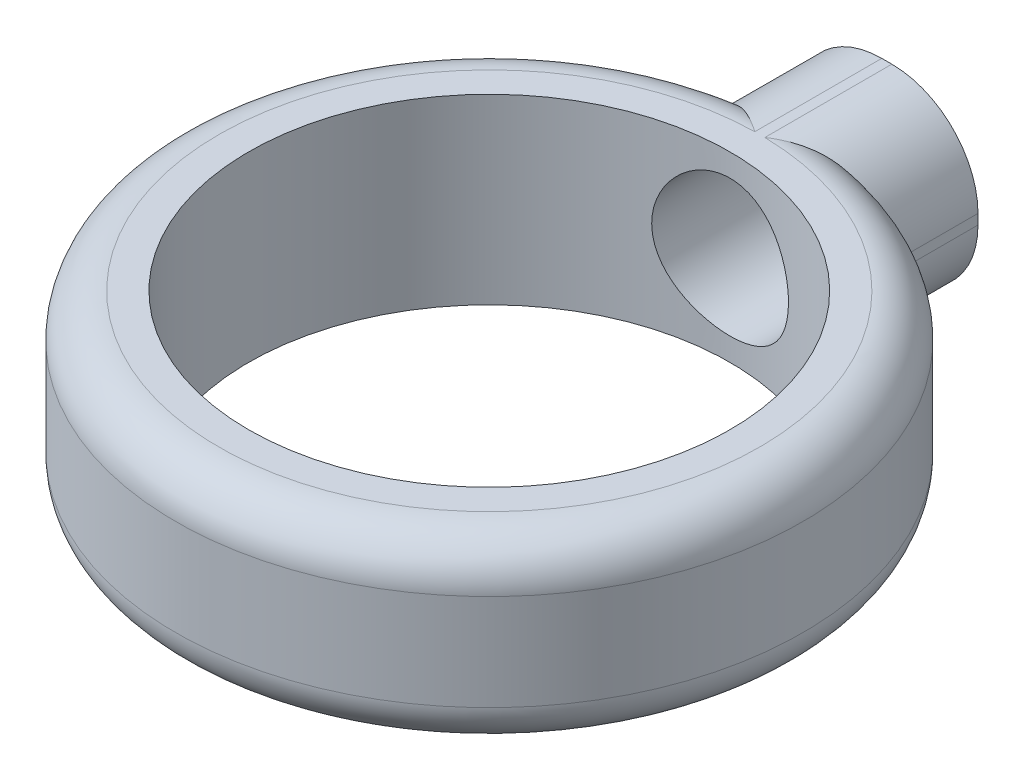
ISO-10303-21;
HEADER;
FILE_DESCRIPTION(('STEP AP214'),'2;1');
FILE_NAME('part.step','',(''),(''),'','','');
FILE_SCHEMA(('AUTOMOTIVE_DESIGN { 1 0 10303 214 1 1 1 1 }'));
ENDSEC;
DATA;
#1=APPLICATION_CONTEXT('core data for automotive mechanical design processes');
#2=APPLICATION_PROTOCOL_DEFINITION('international standard','automotive_design',2000,#1);
#3=PRODUCT_CONTEXT('',#1,'mechanical');
#4=PRODUCT('Part','Part','',(#3));
#5=PRODUCT_RELATED_PRODUCT_CATEGORY('part','',(#4));
#6=PRODUCT_DEFINITION_FORMATION('','',#4);
#7=PRODUCT_DEFINITION_CONTEXT('part definition',#1,'design');
#8=PRODUCT_DEFINITION('design','',#6,#7);
#9=PRODUCT_DEFINITION_SHAPE('','',#8);
#10=(LENGTH_UNIT() NAMED_UNIT(*) SI_UNIT(.MILLI.,.METRE.));
#11=(NAMED_UNIT(*) PLANE_ANGLE_UNIT() SI_UNIT($,.RADIAN.));
#12=(NAMED_UNIT(*) SI_UNIT($,.STERADIAN.) SOLID_ANGLE_UNIT());
#13=UNCERTAINTY_MEASURE_WITH_UNIT(LENGTH_MEASURE(1.E-05),#10,'distance_accuracy_value','');
#14=(GEOMETRIC_REPRESENTATION_CONTEXT(3) GLOBAL_UNCERTAINTY_ASSIGNED_CONTEXT((#13)) GLOBAL_UNIT_ASSIGNED_CONTEXT((#10,
#11,#12)) REPRESENTATION_CONTEXT('',''));
#15=CARTESIAN_POINT('',(0.,0.,0.));
#16=DIRECTION('',(0.,0.,1.));
#17=DIRECTION('',(1.,0.,0.));
#18=AXIS2_PLACEMENT_3D('',#15,#16,#17);
#19=CARTESIAN_POINT('',(0.,12.7,0.));
#20=DIRECTION('',(0.,1.,0.));
#21=DIRECTION('',(0.,0.,1.));
#22=AXIS2_PLACEMENT_3D('',#19,#20,#21);
#23=PLANE('',#22);
#24=DIRECTION('',(-1.,0.,0.));
#25=VECTOR('',#24,1.);
#26=CARTESIAN_POINT('',(6.35,12.7,-27.686));
#27=LINE('',#26,#25);
#28=CARTESIAN_POINT('',(0.35,12.7,-27.686));
#29=VERTEX_POINT('',#28);
#30=CARTESIAN_POINT('',(-0.35,12.7,-27.686));
#31=VERTEX_POINT('',#30);
#32=EDGE_CURVE('E257',#29,#31,#27,.T.);
#33=ORIENTED_EDGE('',*,*,#32,.T.);
#34=DIRECTION('',(0.,0.,1.));
#35=VECTOR('',#34,1.);
#36=CARTESIAN_POINT('',(-0.349999999999997,12.7,-17.7418667563478));
#37=LINE('',#36,#35);
#38=CARTESIAN_POINT('',(-0.349999999999997,12.7,-18.8407493481549));
#39=VERTEX_POINT('',#38);
#40=EDGE_CURVE('E160',#31,#39,#37,.T.);
#41=ORIENTED_EDGE('',*,*,#40,.T.);
#42=CARTESIAN_POINT('',(0.,12.7,0.));
#43=DIRECTION('',(0.,1.,0.));
#44=DIRECTION('',(0.,0.,1.));
#45=AXIS2_PLACEMENT_3D('',#42,#43,#44);
#46=CIRCLE('',#45,18.844);
#47=CARTESIAN_POINT('',(0.349999999999997,12.7,-18.8407493481549));
#48=VERTEX_POINT('',#47);
#49=EDGE_CURVE('E138',#39,#48,#46,.T.);
#50=ORIENTED_EDGE('',*,*,#49,.T.);
#51=DIRECTION('',(0.,0.,-1.));
#52=VECTOR('',#51,1.);
#53=CARTESIAN_POINT('',(0.35,12.7,-27.686));
#54=LINE('',#53,#52);
#55=EDGE_CURVE('E157',#48,#29,#54,.T.);
#56=ORIENTED_EDGE('',*,*,#55,.T.);
#57=EDGE_LOOP('',(#33,#41,#50,#56));
#58=FACE_BOUND('',#57,.T.);
#59=CARTESIAN_POINT('',(0.,12.7,0.));
#60=DIRECTION('',(0.,1.,0.));
#61=DIRECTION('',(0.,0.,1.));
#62=AXIS2_PLACEMENT_3D('',#59,#60,#61);
#63=CIRCLE('',#62,16.764);
#64=CARTESIAN_POINT('',(0.,12.7,16.764));
#65=VERTEX_POINT('',#64);
#66=EDGE_CURVE('E279',#65,#65,#63,.T.);
#67=ORIENTED_EDGE('',*,*,#66,.F.);
#68=EDGE_LOOP('',(#67));
#69=FACE_BOUND('',#68,.T.);
#70=ADVANCED_FACE('F32',(#58,#69),#23,.T.);
#71=CARTESIAN_POINT('',(0.,0.,0.));
#72=DIRECTION('',(0.,1.,0.));
#73=DIRECTION('',(0.,0.,1.));
#74=AXIS2_PLACEMENT_3D('',#71,#72,#73);
#75=PLANE('',#74);
#76=CARTESIAN_POINT('',(0.,0.,0.));
#77=DIRECTION('',(0.,1.,0.));
#78=DIRECTION('',(0.,0.,1.));
#79=AXIS2_PLACEMENT_3D('',#76,#77,#78);
#80=CIRCLE('',#79,18.844);
#81=CARTESIAN_POINT('',(0.349999999999997,0.,-18.8407493481549));
#82=VERTEX_POINT('',#81);
#83=CARTESIAN_POINT('',(-0.349999999999997,0.,-18.8407493481549));
#84=VERTEX_POINT('',#83);
#85=EDGE_CURVE('E142',#82,#84,#80,.F.);
#86=ORIENTED_EDGE('',*,*,#85,.T.);
#87=DIRECTION('',(0.,0.,1.));
#88=VECTOR('',#87,1.);
#89=CARTESIAN_POINT('',(-0.349999999999993,0.,0.));
#90=LINE('',#89,#88);
#91=CARTESIAN_POINT('',(-0.35,0.,-27.686));
#92=VERTEX_POINT('',#91);
#93=EDGE_CURVE('E148',#84,#92,#90,.F.);
#94=ORIENTED_EDGE('',*,*,#93,.T.);
#95=DIRECTION('',(-1.,0.,0.));
#96=VECTOR('',#95,1.);
#97=CARTESIAN_POINT('',(6.35,0.,-27.686));
#98=LINE('',#97,#96);
#99=CARTESIAN_POINT('',(0.35,0.,-27.686));
#100=VERTEX_POINT('',#99);
#101=EDGE_CURVE('E278',#100,#92,#98,.T.);
#102=ORIENTED_EDGE('',*,*,#101,.F.);
#103=DIRECTION('',(0.,0.,-1.));
#104=VECTOR('',#103,1.);
#105=CARTESIAN_POINT('',(0.349999999999993,0.,0.));
#106=LINE('',#105,#104);
#107=EDGE_CURVE('E140',#100,#82,#106,.F.);
#108=ORIENTED_EDGE('',*,*,#107,.T.);
#109=EDGE_LOOP('',(#86,#94,#102,#108));
#110=FACE_BOUND('',#109,.T.);
#111=CARTESIAN_POINT('',(0.,0.,0.));
#112=DIRECTION('',(0.,1.,0.));
#113=DIRECTION('',(0.,0.,1.));
#114=AXIS2_PLACEMENT_3D('',#111,#112,#113);
#115=CIRCLE('',#114,16.764);
#116=CARTESIAN_POINT('',(0.,0.,16.764));
#117=VERTEX_POINT('',#116);
#118=EDGE_CURVE('E282',#117,#117,#115,.T.);
#119=ORIENTED_EDGE('',*,*,#118,.T.);
#120=EDGE_LOOP('',(#119));
#121=FACE_BOUND('',#120,.T.);
#122=ADVANCED_FACE('F224',(#110,#121),#75,.F.);
#123=CARTESIAN_POINT('',(6.35,12.7,-27.686));
#124=DIRECTION('',(0.,0.,1.));
#125=DIRECTION('',(1.,0.,0.));
#126=AXIS2_PLACEMENT_3D('',#123,#124,#125);
#127=PLANE('',#126);
#128=CARTESIAN_POINT('',(0.,6.35,-27.686));
#129=DIRECTION('',(0.,0.,-1.));
#130=DIRECTION('',(-1.,0.,0.));
#131=AXIS2_PLACEMENT_3D('',#128,#129,#130);
#132=CIRCLE('',#131,4.7625);
#133=CARTESIAN_POINT('',(-4.7625,6.35,-27.686));
#134=VERTEX_POINT('',#133);
#135=EDGE_CURVE('E286',#134,#134,#132,.T.);
#136=ORIENTED_EDGE('',*,*,#135,.F.);
#137=EDGE_LOOP('',(#136));
#138=FACE_BOUND('',#137,.T.);
#139=ORIENTED_EDGE('',*,*,#101,.T.);
#140=CARTESIAN_POINT('',(-0.35,6.,-27.686));
#141=DIRECTION('',(0.,0.,1.));
#142=DIRECTION('',(1.,0.,0.));
#143=AXIS2_PLACEMENT_3D('',#140,#141,#142);
#144=CIRCLE('',#143,6.);
#145=CARTESIAN_POINT('',(-6.35,6.,-27.686));
#146=VERTEX_POINT('',#145);
#147=EDGE_CURVE('E155',#92,#146,#144,.F.);
#148=ORIENTED_EDGE('',*,*,#147,.T.);
#149=DIRECTION('',(0.,-1.,0.));
#150=VECTOR('',#149,1.);
#151=CARTESIAN_POINT('',(-6.35,12.7,-27.686));
#152=LINE('',#151,#150);
#153=CARTESIAN_POINT('',(-6.35,6.7,-27.686));
#154=VERTEX_POINT('',#153);
#155=EDGE_CURVE('E131',#154,#146,#152,.T.);
#156=ORIENTED_EDGE('',*,*,#155,.F.);
#157=CARTESIAN_POINT('',(-0.35,6.7,-27.686));
#158=DIRECTION('',(0.,0.,1.));
#159=DIRECTION('',(1.,0.,0.));
#160=AXIS2_PLACEMENT_3D('',#157,#158,#159);
#161=CIRCLE('',#160,6.);
#162=EDGE_CURVE('E137',#154,#31,#161,.F.);
#163=ORIENTED_EDGE('',*,*,#162,.T.);
#164=ORIENTED_EDGE('',*,*,#32,.F.);
#165=CARTESIAN_POINT('',(0.35,6.7,-27.686));
#166=DIRECTION('',(0.,0.,1.));
#167=DIRECTION('',(1.,0.,0.));
#168=AXIS2_PLACEMENT_3D('',#165,#166,#167);
#169=CIRCLE('',#168,6.);
#170=CARTESIAN_POINT('',(6.35,6.7,-27.686));
#171=VERTEX_POINT('',#170);
#172=EDGE_CURVE('E152',#29,#171,#169,.F.);
#173=ORIENTED_EDGE('',*,*,#172,.T.);
#174=DIRECTION('',(0.,-1.,0.));
#175=VECTOR('',#174,1.);
#176=CARTESIAN_POINT('',(6.35,12.7,-27.686));
#177=LINE('',#176,#175);
#178=CARTESIAN_POINT('',(6.35,6.,-27.686));
#179=VERTEX_POINT('',#178);
#180=EDGE_CURVE('E251',#171,#179,#177,.T.);
#181=ORIENTED_EDGE('',*,*,#180,.T.);
#182=CARTESIAN_POINT('',(0.35,6.,-27.686));
#183=DIRECTION('',(0.,0.,1.));
#184=DIRECTION('',(1.,0.,0.));
#185=AXIS2_PLACEMENT_3D('',#182,#183,#184);
#186=CIRCLE('',#185,6.);
#187=EDGE_CURVE('E150',#179,#100,#186,.F.);
#188=ORIENTED_EDGE('',*,*,#187,.T.);
#189=EDGE_LOOP('',(#139,#148,#156,#163,#164,#173,#181,#188));
#190=FACE_BOUND('',#189,.T.);
#191=ADVANCED_FACE('F221',(#138,#190),#127,.F.);
#192=CARTESIAN_POINT('',(-6.35,12.7,-27.686));
#193=DIRECTION('',(1.,0.,0.));
#194=DIRECTION('',(0.,0.,-1.));
#195=AXIS2_PLACEMENT_3D('',#192,#193,#194);
#196=PLANE('',#195);
#197=ORIENTED_EDGE('',*,*,#155,.T.);
#198=DIRECTION('',(0.,0.,1.));
#199=VECTOR('',#198,1.);
#200=CARTESIAN_POINT('',(-6.35,6.,-27.686));
#201=LINE('',#200,#199);
#202=CARTESIAN_POINT('',(-6.35,6.,-20.9006659224054));
#203=VERTEX_POINT('',#202);
#204=EDGE_CURVE('E130',#146,#203,#201,.T.);
#205=ORIENTED_EDGE('',*,*,#204,.T.);
#206=DIRECTION('',(0.,-1.,0.));
#207=VECTOR('',#206,1.);
#208=CARTESIAN_POINT('',(-6.35,12.7,-20.9006659224054));
#209=LINE('',#208,#207);
#210=CARTESIAN_POINT('',(-6.35,6.7,-20.9006659224054));
#211=VERTEX_POINT('',#210);
#212=EDGE_CURVE('E116',#211,#203,#209,.T.);
#213=ORIENTED_EDGE('',*,*,#212,.F.);
#214=DIRECTION('',(0.,0.,1.));
#215=VECTOR('',#214,1.);
#216=CARTESIAN_POINT('',(-6.35,6.7,-27.686));
#217=LINE('',#216,#215);
#218=EDGE_CURVE('E127',#211,#154,#217,.F.);
#219=ORIENTED_EDGE('',*,*,#218,.T.);
#220=EDGE_LOOP('',(#197,#205,#213,#219));
#221=FACE_BOUND('',#220,.T.);
#222=ADVANCED_FACE('F126',(#221),#196,.F.);
#223=CARTESIAN_POINT('',(0.,12.7,0.));
#224=DIRECTION('',(0.,-1.,0.));
#225=DIRECTION('',(0.,0.,-1.));
#226=AXIS2_PLACEMENT_3D('',#223,#224,#225);
#227=CYLINDRICAL_SURFACE('',#226,21.844);
#228=CARTESIAN_POINT('',(0.,9.7,0.));
#229=DIRECTION('',(0.,1.,0.));
#230=DIRECTION('',(0.,0.,1.));
#231=AXIS2_PLACEMENT_3D('',#228,#229,#230);
#232=CIRCLE('',#231,21.844);
#233=CARTESIAN_POINT('',(5.54615242270663,9.7,-21.1281927600092));
#234=VERTEX_POINT('',#233);
#235=CARTESIAN_POINT('',(-5.54615242270663,9.7,-21.1281927600092));
#236=VERTEX_POINT('',#235);
#237=EDGE_CURVE('E59',#234,#236,#232,.F.);
#238=ORIENTED_EDGE('',*,*,#237,.T.);
#239=CARTESIAN_POINT('',(-5.54615242270663,9.7,-21.1281927600092));
#240=CARTESIAN_POINT('',(-5.62869555834243,9.55706241046992,-21.1065181383437));
#241=CARTESIAN_POINT('',(-5.70538652745696,9.41057678959266,-21.0858761637742));
#242=CARTESIAN_POINT('',(-5.8465725633866,9.11143295779543,-21.0471700747369));
#243=CARTESIAN_POINT('',(-5.9110620329338,8.95877195279276,-21.0291071442974));
#244=CARTESIAN_POINT('',(-6.02598011956818,8.65179772322703,-20.9964609210033));
#245=CARTESIAN_POINT('',(-6.0766904303833,8.49759741637347,-20.9818089653315));
#246=CARTESIAN_POINT('',(-6.16548658934499,8.18541181959385,-20.9558882274492));
#247=CARTESIAN_POINT('',(-6.20357792667038,8.02742820753624,-20.9446179744198));
#248=CARTESIAN_POINT('',(-6.27304882696002,7.67736376686289,-20.9239284567496));
#249=CARTESIAN_POINT('',(-6.30164871291669,7.48467007857076,-20.9153051907715));
#250=CARTESIAN_POINT('',(-6.33053798954638,7.19286308526323,-20.9065710322217));
#251=CARTESIAN_POINT('',(-6.3378332828715,7.09445054443067,-20.9043594155445));
#252=CARTESIAN_POINT('',(-6.3475642560985,6.89736516420813,-20.9014061351694));
#253=CARTESIAN_POINT('',(-6.3500000159953,6.79869232912974,-20.9006644472744));
#254=CARTESIAN_POINT('',(-6.35,6.7,-20.9006659224054));
#255=B_SPLINE_CURVE_WITH_KNOTS('',3,(#239,#240,#241,#242,#243,#244,#245,#246,#247,#248,#249,
#250,#251,#252,#253,#254),.UNSPECIFIED.,.F.,.F.,(4,2,2,2,2,2,2,4),(0.,0.499301875187812,
0.998832245734701,1.4872138569556,1.97538274525619,2.55925196054153,2.85526223868959,
3.1512676440418),.UNSPECIFIED.);
#256=EDGE_CURVE('E113',#236,#211,#255,.T.);
#257=ORIENTED_EDGE('',*,*,#256,.T.);
#258=ORIENTED_EDGE('',*,*,#212,.T.);
#259=CARTESIAN_POINT('',(-6.35,6.,-20.9006659224054));
#260=CARTESIAN_POINT('',(-6.35002280042576,5.83353583030063,-20.9006432846822));
#261=CARTESIAN_POINT('',(-6.34307336288711,5.66707922686271,-20.9027699308018));
#262=CARTESIAN_POINT('',(-6.31539495313004,5.33540609973612,-20.9111574628453));
#263=CARTESIAN_POINT('',(-6.29466491293805,5.17018967316273,-20.9174186691904));
#264=CARTESIAN_POINT('',(-6.24019688695677,4.84586003229475,-20.9337292979374));
#265=CARTESIAN_POINT('',(-6.20675550315686,4.6866925452103,-20.9436922341856));
#266=CARTESIAN_POINT('',(-6.12716432241518,4.37189461541182,-20.9671150326871));
#267=CARTESIAN_POINT('',(-6.08101862636097,4.21626304883969,-20.9805737664356));
#268=CARTESIAN_POINT('',(-5.96607242242846,3.87931241884731,-21.013581426997));
#269=CARTESIAN_POINT('',(-5.89460062008399,3.69896619012894,-21.0338076546501));
#270=CARTESIAN_POINT('',(-5.73370250523079,3.34399833846208,-21.0782322748146));
#271=CARTESIAN_POINT('',(-5.64404692942392,3.16948680177053,-21.1024805846146));
#272=CARTESIAN_POINT('',(-5.54615242270663,3.,-21.1281927600092));
#273=B_SPLINE_CURVE_WITH_KNOTS('',3,(#259,#260,#261,#262,#263,#264,#265,#266,#267,#268,#269,
#270,#271,#272),.UNSPECIFIED.,.F.,.F.,(4,2,2,2,2,2,4),(0.,0.499222724076475,0.998484141586656,
1.48674768267672,1.97485379919353,2.55902587045443,3.15108073405853),.UNSPECIFIED.);
#274=CARTESIAN_POINT('',(-5.54615242270663,3.,-21.1281927600092));
#275=VERTEX_POINT('',#274);
#276=EDGE_CURVE('E168',#203,#275,#273,.T.);
#277=ORIENTED_EDGE('',*,*,#276,.T.);
#278=CARTESIAN_POINT('',(0.,3.,0.));
#279=DIRECTION('',(0.,1.,0.));
#280=DIRECTION('',(0.,0.,1.));
#281=AXIS2_PLACEMENT_3D('',#278,#279,#280);
#282=CIRCLE('',#281,21.844);
#283=CARTESIAN_POINT('',(5.54615242270663,3.,-21.1281927600092));
#284=VERTEX_POINT('',#283);
#285=EDGE_CURVE('E51',#275,#284,#282,.T.);
#286=ORIENTED_EDGE('',*,*,#285,.T.);
#287=CARTESIAN_POINT('',(5.54615242270663,3.,-21.1281927600092));
#288=CARTESIAN_POINT('',(5.62869555834243,3.14293758953008,-21.1065181383437));
#289=CARTESIAN_POINT('',(5.70538652745696,3.28942321040734,-21.0858761637742));
#290=CARTESIAN_POINT('',(5.8465725633866,3.58856704220457,-21.0471700747369));
#291=CARTESIAN_POINT('',(5.9110620329338,3.74122804720724,-21.0291071442973));
#292=CARTESIAN_POINT('',(6.02598011956818,4.04820227677297,-20.9964609210033));
#293=CARTESIAN_POINT('',(6.0766904303833,4.20240258362653,-20.9818089653315));
#294=CARTESIAN_POINT('',(6.16548658934499,4.51458818040614,-20.9558882274492));
#295=CARTESIAN_POINT('',(6.20357792667038,4.67257179246375,-20.9446179744198));
#296=CARTESIAN_POINT('',(6.27304882696002,5.02263623313711,-20.9239284567496));
#297=CARTESIAN_POINT('',(6.30164871291669,5.21532992142924,-20.9153051907715));
#298=CARTESIAN_POINT('',(6.33053798954638,5.50713691473677,-20.9065710322217));
#299=CARTESIAN_POINT('',(6.3378332828715,5.60554945556933,-20.9043594155445));
#300=CARTESIAN_POINT('',(6.3475642560985,5.80263483579187,-20.9014061351694));
#301=CARTESIAN_POINT('',(6.3500000159953,5.90130767087026,-20.9006644472744));
#302=CARTESIAN_POINT('',(6.35,6.,-20.9006659224054));
#303=B_SPLINE_CURVE_WITH_KNOTS('',3,(#287,#288,#289,#290,#291,#292,#293,#294,#295,#296,#297,
#298,#299,#300,#301,#302),.UNSPECIFIED.,.F.,.F.,(4,2,2,2,2,2,2,4),(0.,0.499301875187811,
0.9988322457347,1.48721385695559,1.97538274525619,2.55925196054153,2.85526223868959,
3.1512676440418),.UNSPECIFIED.);
#304=CARTESIAN_POINT('',(6.34999999999999,6.,-20.9006659224054));
#305=VERTEX_POINT('',#304);
#306=EDGE_CURVE('E11',#284,#305,#303,.T.);
#307=ORIENTED_EDGE('',*,*,#306,.T.);
#308=DIRECTION('',(0.,-1.,0.));
#309=VECTOR('',#308,1.);
#310=CARTESIAN_POINT('',(6.34999999999999,12.7,-20.9006659224054));
#311=LINE('',#310,#309);
#312=CARTESIAN_POINT('',(6.34999999999999,6.7,-20.9006659224054));
#313=VERTEX_POINT('',#312);
#314=EDGE_CURVE('E132',#313,#305,#311,.T.);
#315=ORIENTED_EDGE('',*,*,#314,.F.);
#316=CARTESIAN_POINT('',(6.35,6.7,-20.9006659224054));
#317=CARTESIAN_POINT('',(6.35002280042576,6.86646416969937,-20.9006432846822));
#318=CARTESIAN_POINT('',(6.34307336288711,7.03292077313729,-20.9027699308018));
#319=CARTESIAN_POINT('',(6.31539495313004,7.36459390026388,-20.9111574628453));
#320=CARTESIAN_POINT('',(6.29466491293805,7.52981032683727,-20.9174186691904));
#321=CARTESIAN_POINT('',(6.24019688695677,7.85413996770525,-20.9337292979374));
#322=CARTESIAN_POINT('',(6.20675550315686,8.0133074547897,-20.9436922341856));
#323=CARTESIAN_POINT('',(6.12716432241518,8.32810538458818,-20.9671150326871));
#324=CARTESIAN_POINT('',(6.08101862636097,8.4837369511603,-20.9805737664356));
#325=CARTESIAN_POINT('',(5.96607242242846,8.82068758115269,-21.013581426997));
#326=CARTESIAN_POINT('',(5.89460062008399,9.00103380987106,-21.0338076546501));
#327=CARTESIAN_POINT('',(5.73370250523079,9.35600166153792,-21.0782322748146));
#328=CARTESIAN_POINT('',(5.64404692942392,9.53051319822947,-21.1024805846146));
#329=CARTESIAN_POINT('',(5.54615242270663,9.7,-21.1281927600092));
#330=B_SPLINE_CURVE_WITH_KNOTS('',3,(#316,#317,#318,#319,#320,#321,#322,#323,#324,#325,#326,
#327,#328,#329),.UNSPECIFIED.,.F.,.F.,(4,2,2,2,2,2,4),(0.,0.499222724076475,0.998484141586655,
1.48674768267672,1.97485379919353,2.55902587045443,3.15108073405853),.UNSPECIFIED.);
#331=EDGE_CURVE('E120',#313,#234,#330,.T.);
#332=ORIENTED_EDGE('',*,*,#331,.T.);
#333=EDGE_LOOP('',(#238,#257,#258,#277,#286,#307,#315,#332));
#334=FACE_BOUND('',#333,.T.);
#335=ADVANCED_FACE('F115',(#334),#227,.T.);
#336=CARTESIAN_POINT('',(6.35,12.7,-20.9006659224054));
#337=DIRECTION('',(-1.,0.,0.));
#338=DIRECTION('',(0.,0.,1.));
#339=AXIS2_PLACEMENT_3D('',#336,#337,#338);
#340=PLANE('',#339);
#341=ORIENTED_EDGE('',*,*,#180,.F.);
#342=DIRECTION('',(0.,0.,-1.));
#343=VECTOR('',#342,1.);
#344=CARTESIAN_POINT('',(6.35,6.7,-17.7418667563478));
#345=LINE('',#344,#343);
#346=EDGE_CURVE('E166',#171,#313,#345,.F.);
#347=ORIENTED_EDGE('',*,*,#346,.T.);
#348=ORIENTED_EDGE('',*,*,#314,.T.);
#349=DIRECTION('',(0.,0.,-1.));
#350=VECTOR('',#349,1.);
#351=CARTESIAN_POINT('',(6.35,6.,-20.9006659224054));
#352=LINE('',#351,#350);
#353=EDGE_CURVE('E163',#305,#179,#352,.T.);
#354=ORIENTED_EDGE('',*,*,#353,.T.);
#355=EDGE_LOOP('',(#341,#347,#348,#354));
#356=FACE_BOUND('',#355,.T.);
#357=ADVANCED_FACE('F230',(#356),#340,.F.);
#358=CARTESIAN_POINT('',(0.,12.7,0.));
#359=DIRECTION('',(0.,-1.,0.));
#360=DIRECTION('',(0.,0.,-1.));
#361=AXIS2_PLACEMENT_3D('',#358,#359,#360);
#362=CYLINDRICAL_SURFACE('',#361,16.764);
#363=CARTESIAN_POINT('',(-4.7625,6.35,-16.073278749216));
#364=CARTESIAN_POINT('',(-4.76249513450348,6.61165199667704,-16.0732825026634));
#365=CARTESIAN_POINT('',(-4.74086381860136,6.8733533443505,-16.0797376727915));
#366=CARTESIAN_POINT('',(-4.65510374146149,7.38915062526841,-16.1047706745241));
#367=CARTESIAN_POINT('',(-4.59095734621983,7.64324335695689,-16.1233535362893));
#368=CARTESIAN_POINT('',(-4.42248428682676,8.13628502474765,-16.1703711503572));
#369=CARTESIAN_POINT('',(-4.31821933466604,8.37525656665641,-16.1987907646571));
#370=CARTESIAN_POINT('',(-4.07266731097301,8.83236434766814,-16.2622598236533));
#371=CARTESIAN_POINT('',(-3.9313759740004,9.05049818231366,-16.2973100320647));
#372=CARTESIAN_POINT('',(-3.6114913240912,9.46592871223389,-16.3712061689946));
#373=CARTESIAN_POINT('',(-3.43203332505258,9.66254651449708,-16.4101264538359));
#374=CARTESIAN_POINT('',(-3.04276583604361,10.02333931522,-16.4867390475613));
#375=CARTESIAN_POINT('',(-2.83295283404967,10.1875105544586,-16.5244312137349));
#376=CARTESIAN_POINT('',(-2.38416143679409,10.4816403787922,-16.5951780341498));
#377=CARTESIAN_POINT('',(-2.14471815664303,10.6109152277648,-16.6281348004192));
#378=CARTESIAN_POINT('',(-1.64639891529389,10.827108368078,-16.6848388795616));
#379=CARTESIAN_POINT('',(-1.38752670377605,10.9140348083008,-16.7085879640409));
#380=CARTESIAN_POINT('',(-0.864792887730299,11.0408412573026,-16.7436748650993));
#381=CARTESIAN_POINT('',(-0.601232740528084,11.08187816531,-16.7553173371465));
#382=CARTESIAN_POINT('',(-0.0707286659322209,11.1193897963387,-16.765948329422));
#383=CARTESIAN_POINT('',(0.196214612173759,11.1158729444769,-16.7649392420607));
#384=CARTESIAN_POINT('',(0.717822634119251,11.0651722008312,-16.7506000398279));
#385=CARTESIAN_POINT('',(0.972620222533095,11.0192396605195,-16.7376230181548));
#386=CARTESIAN_POINT('',(1.47072963333473,10.887044415247,-16.701229017973));
#387=CARTESIAN_POINT('',(1.71404075936807,10.8007792686133,-16.6778114074114));
#388=CARTESIAN_POINT('',(2.18535254379023,10.5894661209111,-16.6226619168489));
#389=CARTESIAN_POINT('',(2.4131584214518,10.4640074472342,-16.5908425766166));
#390=CARTESIAN_POINT('',(2.84489729887709,10.1781884113172,-16.5222912841597));
#391=CARTESIAN_POINT('',(3.04882510178515,10.0178204730121,-16.4855582662291));
#392=CARTESIAN_POINT('',(3.43448980742105,9.66016866965143,-16.4096307461489));
#393=CARTESIAN_POINT('',(3.61521075943649,9.46179665045999,-16.3703950612761));
#394=CARTESIAN_POINT('',(3.94108886728935,9.03716540767221,-16.2950166148834));
#395=CARTESIAN_POINT('',(4.08624320500125,8.81090397638807,-16.2588740985987));
#396=CARTESIAN_POINT('',(4.33778370910131,8.33447559712568,-16.1935920140358));
#397=CARTESIAN_POINT('',(4.44385804528582,8.08413565036798,-16.1645093796521));
#398=CARTESIAN_POINT('',(4.6120635729373,7.56813613107293,-16.1173286658096));
#399=CARTESIAN_POINT('',(4.67420738158955,7.30248098090637,-16.0992274326199));
#400=CARTESIAN_POINT('',(4.75096188175811,6.77297991574064,-16.0767413862449));
#401=CARTESIAN_POINT('',(4.76710282829595,6.50937434726192,-16.0719151854672));
#402=CARTESIAN_POINT('',(4.75563885721104,5.98322315661853,-16.0753113634898));
#403=CARTESIAN_POINT('',(4.72803932443989,5.72067740796949,-16.083532136089));
#404=CARTESIAN_POINT('',(4.6312342229869,5.21023882695161,-16.1116660618343));
#405=CARTESIAN_POINT('',(4.56298154816852,4.96214903433144,-16.1313111904106));
#406=CARTESIAN_POINT('',(4.38789592477086,4.48094791653445,-16.1798103706309));
#407=CARTESIAN_POINT('',(4.28105745398408,4.24783874093689,-16.2086657403301));
#408=CARTESIAN_POINT('',(4.02883116589095,3.79690449880953,-16.2732144690924));
#409=CARTESIAN_POINT('',(3.88256283750213,3.57959396255244,-16.3090580680724));
#410=CARTESIAN_POINT('',(3.55669668990073,3.17204132976548,-16.3832070976988));
#411=CARTESIAN_POINT('',(3.37709173108537,2.98180504709306,-16.4215130545498));
#412=CARTESIAN_POINT('',(2.98251279313718,2.62727614790072,-16.4978164116873));
#413=CARTESIAN_POINT('',(2.76655929820043,2.46405987473866,-16.5357609511795));
#414=CARTESIAN_POINT('',(2.30944577219369,2.17617601411465,-16.6057682311817));
#415=CARTESIAN_POINT('',(2.06828706419604,2.05150640461921,-16.6378312801796));
#416=CARTESIAN_POINT('',(1.5692828600596,1.84544215136563,-16.6922583359873));
#417=CARTESIAN_POINT('',(1.31158099757052,1.76371996593215,-16.7146955063851));
#418=CARTESIAN_POINT('',(0.785359200218526,1.64496867192201,-16.7476658248699));
#419=CARTESIAN_POINT('',(0.516842031973897,1.60792820759617,-16.7582019975229));
#420=CARTESIAN_POINT('',(-0.0133899099393455,1.58038175957168,-16.7660191670237));
#421=CARTESIAN_POINT('',(-0.275017646214743,1.5883065154551,-16.7637471795754));
#422=CARTESIAN_POINT('',(-0.793061329597648,1.64676705577472,-16.7472359648124));
#423=CARTESIAN_POINT('',(-1.04947752079265,1.69730083984631,-16.7329972992969));
#424=CARTESIAN_POINT('',(-1.54766392769926,1.83861240493104,-16.6942616961913));
#425=CARTESIAN_POINT('',(-1.78954266133389,1.92903419209064,-16.6698556060461));
#426=CARTESIAN_POINT('',(-2.25483003481905,2.14723839437428,-16.6133208277977));
#427=CARTESIAN_POINT('',(-2.47823582988799,2.27502655012179,-16.5811909532185));
#428=CARTESIAN_POINT('',(-2.90738412113907,2.56871608204709,-16.5114354807736));
#429=CARTESIAN_POINT('',(-3.11241183350235,2.73562989417278,-16.4736758021059));
#430=CARTESIAN_POINT('',(-3.49207596002926,3.10096235187998,-16.3973984886597));
#431=CARTESIAN_POINT('',(-3.66670398755186,3.29938966259968,-16.358880647972));
#432=CARTESIAN_POINT('',(-3.985121842029,3.72828872162115,-16.2842865714545));
#433=CARTESIAN_POINT('',(-4.12799647546241,3.95945695460595,-16.248299338139));
#434=CARTESIAN_POINT('',(-4.37266601469316,4.44352520546739,-16.1841769950907));
#435=CARTESIAN_POINT('',(-4.4744842618799,4.69641277597565,-16.1560374266153));
#436=CARTESIAN_POINT('',(-4.62290895681762,5.18145962414797,-16.1141399942395));
#437=CARTESIAN_POINT('',(-4.67512220543307,5.41179312850569,-16.0989512794621));
#438=CARTESIAN_POINT('',(-4.74491726236974,5.8780716189507,-16.0785197279018));
#439=CARTESIAN_POINT('',(-4.76250438819738,6.11401573778699,-16.0732753639772));
#440=CARTESIAN_POINT('',(-4.7625,6.35,-16.073278749216));
#441=B_SPLINE_CURVE_WITH_KNOTS('',3,(#363,#364,#365,#366,#367,#368,#369,#370,#371,#372,#373,
#374,#375,#376,#377,#378,#379,#380,#381,#382,#383,#384,#385,#386,#387,#388,#389,#390,#391,#392,
#393,#394,#395,#396,#397,#398,#399,#400,#401,#402,#403,#404,#405,#406,#407,#408,#409,#410,#411,
#412,#413,#414,#415,#416,#417,#418,#419,#420,#421,#422,#423,#424,#425,#426,#427,#428,#429,#430,
#431,#432,#433,#434,#435,#436,#437,#438,#439,#440),.UNSPECIFIED.,.T.,.F.,(4,2,2,2,2,2,2,2,2,2,2,
2,2,2,2,2,2,2,2,2,2,2,2,2,2,2,2,2,2,2,2,2,2,2,2,2,2,2,4),(0.,0.784086873412155,1.56849916667953,
2.35170963801794,3.13501037491287,3.93842491081382,4.74193247489238,5.56019745701797,
6.37830492245288,7.17528670340312,7.97211777733268,8.74616679389807,9.52026267625136,
10.3027582116971,11.0854237351924,11.8952559147612,12.7051522407582,13.5213777438426,
14.3373687253388,15.1258802932128,15.9142947956674,16.6849187146732,17.4556529652788,
18.2452744130514,19.0350651671393,19.8511859772353,20.6672639690033,21.4770242914132,
22.286578771847,23.0680580265437,23.849500595203,24.6241057335261,25.3988299376026,
26.196390860608,26.9941714665907,27.8126014256201,28.6305654323422,29.3378429861503,
30.0450119154265),.UNSPECIFIED.);
#442=CARTESIAN_POINT('',(-4.7625,6.35,-16.073278749216));
#443=VERTEX_POINT('',#442);
#444=EDGE_CURVE('E290',#443,#443,#441,.T.);
#445=ORIENTED_EDGE('',*,*,#444,.T.);
#446=EDGE_LOOP('',(#445));
#447=FACE_BOUND('',#446,.T.);
#448=ORIENTED_EDGE('',*,*,#66,.T.);
#449=EDGE_LOOP('',(#448));
#450=FACE_BOUND('',#449,.T.);
#451=ORIENTED_EDGE('',*,*,#118,.F.);
#452=EDGE_LOOP('',(#451));
#453=FACE_BOUND('',#452,.T.);
#454=ADVANCED_FACE('F219',(#447,#450,#453),#362,.F.);
#455=CARTESIAN_POINT('',(0.,3.,0.));
#456=DIRECTION('',(0.,1.,0.));
#457=DIRECTION('',(0.,0.,1.));
#458=AXIS2_PLACEMENT_3D('',#455,#456,#457);
#459=TOROIDAL_SURFACE('',#458,18.844,3.);
#460=ORIENTED_EDGE('',*,*,#285,.F.);
#461=CARTESIAN_POINT('',(-5.54615242270663,3.,-21.1281927600092));
#462=CARTESIAN_POINT('',(-5.48207657137684,2.8889257949063,-21.1450361583412));
#463=CARTESIAN_POINT('',(-5.41402977259673,2.77937432964942,-21.1561899564225));
#464=CARTESIAN_POINT('',(-5.27085661244564,2.56464757578617,-21.1679545946474));
#465=CARTESIAN_POINT('',(-5.19574170133196,2.45946559402453,-21.1685822011813));
#466=CARTESIAN_POINT('',(-5.03992750704093,2.25554891093564,-21.1602241069974));
#467=CARTESIAN_POINT('',(-4.95929691382864,2.15675706952087,-21.1513416467994));
#468=CARTESIAN_POINT('',(-4.79250976029107,1.96512158508866,-21.124996961707));
#469=CARTESIAN_POINT('',(-4.70635094535342,1.87228040022212,-21.1075312166457));
#470=CARTESIAN_POINT('',(-4.52332490005845,1.68706191206773,-21.0634354127873));
#471=CARTESIAN_POINT('',(-4.42612749061788,1.59514001691935,-21.0362657715647));
#472=CARTESIAN_POINT('',(-4.22723534767256,1.41909237031772,-20.9741192148999));
#473=CARTESIAN_POINT('',(-4.12553823301498,1.33497082133153,-20.9391381251998));
#474=CARTESIAN_POINT('',(-3.81438205089083,1.0941996396122,-20.8236545746285));
#475=CARTESIAN_POINT('',(-3.59933190568623,0.949617213423431,-20.732733129913));
#476=CARTESIAN_POINT('',(-3.09314729783727,0.65344359923505,-20.4986189016225));
#477=CARTESIAN_POINT('',(-2.79888645309059,0.513273685569368,-20.3479457708672));
#478=CARTESIAN_POINT('',(-2.20465244689015,0.284960694084263,-20.0214133716179));
#479=CARTESIAN_POINT('',(-1.90467789746734,0.196830428463813,-19.8455479139867));
#480=CARTESIAN_POINT('',(-1.39661118806068,0.0881390848306337,-19.5327386903519));
#481=CARTESIAN_POINT('',(-1.18828745833382,0.0551849926951538,-19.400199150101));
#482=CARTESIAN_POINT('',(-0.773685779206837,0.0113568436027219,-19.1289881256322));
#483=CARTESIAN_POINT('',(-0.56740517309415,0.000448857296875157,-18.9903264002031));
#484=CARTESIAN_POINT('',(-0.358507671464733,4.52326126016781E-06,-18.8466067709242));
#485=CARTESIAN_POINT('',(-0.354253478181639,2.68460445276242E-10,-18.8436785154342));
#486=CARTESIAN_POINT('',(-0.349999999999997,0.,-18.8407493481549));
#487=B_SPLINE_CURVE_WITH_KNOTS('',3,(#461,#462,#463,#464,#465,#466,#467,#468,#469,#470,#471,
#472,#473,#474,#475,#476,#477,#478,#479,#480,#481,#482,#483,#484,#485,#486),.UNSPECIFIED.,.F.,
.F.,(4,2,2,2,2,2,2,2,2,2,2,2,4),(0.,0.387687766115566,0.774757954376485,1.15766834794074,
1.5407359114897,1.949692596805,2.35886834434647,3.17923632027187,4.25091699800876,
5.32286141441132,6.06919280252736,6.81437469603323,6.82986841764915),.UNSPECIFIED.);
#488=EDGE_CURVE('E174',#275,#84,#487,.T.);
#489=ORIENTED_EDGE('',*,*,#488,.T.);
#490=ORIENTED_EDGE('',*,*,#85,.F.);
#491=CARTESIAN_POINT('',(5.54615242270663,3.,-21.1281927600092));
#492=CARTESIAN_POINT('',(5.48207657137684,2.88892579490631,-21.1450361583412));
#493=CARTESIAN_POINT('',(5.41402977259673,2.77937432964943,-21.1561899564225));
#494=CARTESIAN_POINT('',(5.27085661244565,2.56464757578618,-21.1679545946474));
#495=CARTESIAN_POINT('',(5.19574170133197,2.45946559402454,-21.1685822011813));
#496=CARTESIAN_POINT('',(5.03992750704094,2.25554891093565,-21.1602241069974));
#497=CARTESIAN_POINT('',(4.95929691382865,2.15675706952088,-21.1513416467994));
#498=CARTESIAN_POINT('',(4.79250976029108,1.96512158508866,-21.124996961707));
#499=CARTESIAN_POINT('',(4.70635094535343,1.87228040022212,-21.1075312166457));
#500=CARTESIAN_POINT('',(4.52332490005845,1.68706191206773,-21.0634354127873));
#501=CARTESIAN_POINT('',(4.42612749061787,1.59514001691935,-21.0362657715647));
#502=CARTESIAN_POINT('',(4.22723534767256,1.41909237031772,-20.9741192148999));
#503=CARTESIAN_POINT('',(4.12553823301498,1.33497082133153,-20.9391381251998));
#504=CARTESIAN_POINT('',(3.81438205089082,1.09419963961219,-20.8236545746285));
#505=CARTESIAN_POINT('',(3.59933190568623,0.949617213423429,-20.732733129913));
#506=CARTESIAN_POINT('',(3.09314729783728,0.653443599235053,-20.4986189016225));
#507=CARTESIAN_POINT('',(2.79888645309062,0.513273685569374,-20.3479457708672));
#508=CARTESIAN_POINT('',(2.20465244689015,0.284960694084266,-20.021413371618));
#509=CARTESIAN_POINT('',(1.90467789746728,0.196830428463813,-19.8455479139868));
#510=CARTESIAN_POINT('',(1.39661118806071,0.0881390848306311,-19.5327386903518));
#511=CARTESIAN_POINT('',(1.18828745833393,0.0551849926951503,-19.4001991501008));
#512=CARTESIAN_POINT('',(0.773685779206701,0.0113568436027211,-19.1289881256323));
#513=CARTESIAN_POINT('',(0.567405173093683,0.000448857296876524,-18.9903264002037));
#514=CARTESIAN_POINT('',(0.358507671464715,4.5232612602242E-06,-18.8466067709242));
#515=CARTESIAN_POINT('',(0.35425347818163,2.6846047352398E-10,-18.8436785154342));
#516=CARTESIAN_POINT('',(0.349999999999997,0.,-18.8407493481549));
#517=B_SPLINE_CURVE_WITH_KNOTS('',3,(#491,#492,#493,#494,#495,#496,#497,#498,#499,#500,#501,
#502,#503,#504,#505,#506,#507,#508,#509,#510,#511,#512,#513,#514,#515,#516),.UNSPECIFIED.,.F.,
.F.,(4,2,2,2,2,2,2,2,2,2,2,2,4),(0.,0.387687766115555,0.774757954376463,1.15766834794072,
1.5407359114897,1.94969259680501,2.35886834434648,3.17923632027187,4.25091699800873,
5.32286141441133,6.06919280252739,6.81437469603323,6.82986841764914),.UNSPECIFIED.);
#518=EDGE_CURVE('E45',#82,#284,#517,.F.);
#519=ORIENTED_EDGE('',*,*,#518,.T.);
#520=EDGE_LOOP('',(#460,#489,#490,#519));
#521=FACE_BOUND('',#520,.T.);
#522=ADVANCED_FACE('F215',(#521),#459,.T.);
#523=CARTESIAN_POINT('',(0.,9.7,0.));
#524=DIRECTION('',(0.,1.,0.));
#525=DIRECTION('',(0.,0.,1.));
#526=AXIS2_PLACEMENT_3D('',#523,#524,#525);
#527=TOROIDAL_SURFACE('',#526,18.844,3.);
#528=ORIENTED_EDGE('',*,*,#49,.F.);
#529=CARTESIAN_POINT('',(-5.54615242270663,9.7,-21.1281927600092));
#530=CARTESIAN_POINT('',(-5.48207657137684,9.8110742050937,-21.1450361583412));
#531=CARTESIAN_POINT('',(-5.41402977259672,9.92062567035059,-21.1561899564225));
#532=CARTESIAN_POINT('',(-5.27085661244563,10.1353524242138,-21.1679545946474));
#533=CARTESIAN_POINT('',(-5.19574170133194,10.2405344059755,-21.1685822011813));
#534=CARTESIAN_POINT('',(-5.03992750704091,10.4444510890644,-21.1602241069974));
#535=CARTESIAN_POINT('',(-4.95929691382863,10.5432429304791,-21.1513416467994));
#536=CARTESIAN_POINT('',(-4.79250976029106,10.7348784149114,-21.124996961707));
#537=CARTESIAN_POINT('',(-4.70635094535342,10.8277195997779,-21.1075312166457));
#538=CARTESIAN_POINT('',(-4.52332490005845,11.0129380879323,-21.0634354127873));
#539=CARTESIAN_POINT('',(-4.42612749061788,11.1048599830806,-21.0362657715647));
#540=CARTESIAN_POINT('',(-4.22723534767257,11.2809076296823,-20.9741192148999));
#541=CARTESIAN_POINT('',(-4.125538233015,11.3650291786685,-20.9391381251998));
#542=CARTESIAN_POINT('',(-3.81438205089084,11.6058003603878,-20.8236545746285));
#543=CARTESIAN_POINT('',(-3.59933190568624,11.7503827865766,-20.732733129913));
#544=CARTESIAN_POINT('',(-3.09314729783725,12.046556400765,-20.4986189016225));
#545=CARTESIAN_POINT('',(-2.79888645309055,12.1867263144306,-20.3479457708672));
#546=CARTESIAN_POINT('',(-2.20465244689014,12.4150393059157,-20.0214133716179));
#547=CARTESIAN_POINT('',(-1.9046778974674,12.5031695715362,-19.8455479139866));
#548=CARTESIAN_POINT('',(-1.39661118806063,12.6118609151694,-19.532738690352));
#549=CARTESIAN_POINT('',(-1.18828745833365,12.6448150073048,-19.4001991501012));
#550=CARTESIAN_POINT('',(-0.773685779207028,12.6886431563973,-19.1289881256319));
#551=CARTESIAN_POINT('',(-0.56740517309481,12.6995511427031,-18.9903264002021));
#552=CARTESIAN_POINT('',(-0.358507671464759,12.6999954767387,-18.8466067709242));
#553=CARTESIAN_POINT('',(-0.354253478181652,12.6999999997315,-18.8436785154342));
#554=CARTESIAN_POINT('',(-0.349999999999997,12.7,-18.8407493481549));
#555=B_SPLINE_CURVE_WITH_KNOTS('',3,(#529,#530,#531,#532,#533,#534,#535,#536,#537,#538,#539,
#540,#541,#542,#543,#544,#545,#546,#547,#548,#549,#550,#551,#552,#553,#554),.UNSPECIFIED.,.F.,
.F.,(4,2,2,2,2,2,2,2,2,2,2,2,4),(0.,0.387687766115582,0.774757954376517,1.15766834794075,
1.5407359114897,1.94969259680499,2.35886834434645,3.17923632027187,4.25091699800881,
5.32286141441133,6.06919280252734,6.81437469603323,6.82986841764914),.UNSPECIFIED.);
#556=EDGE_CURVE('E121',#39,#236,#555,.F.);
#557=ORIENTED_EDGE('',*,*,#556,.T.);
#558=ORIENTED_EDGE('',*,*,#237,.F.);
#559=CARTESIAN_POINT('',(5.54615242270663,9.7,-21.1281927600092));
#560=CARTESIAN_POINT('',(5.48207657137684,9.8110742050937,-21.1450361583412));
#561=CARTESIAN_POINT('',(5.41402977259673,9.92062567035058,-21.1561899564225));
#562=CARTESIAN_POINT('',(5.27085661244564,10.1353524242138,-21.1679545946474));
#563=CARTESIAN_POINT('',(5.19574170133196,10.2405344059755,-21.1685822011813));
#564=CARTESIAN_POINT('',(5.03992750704093,10.4444510890644,-21.1602241069974));
#565=CARTESIAN_POINT('',(4.95929691382865,10.5432429304791,-21.1513416467994));
#566=CARTESIAN_POINT('',(4.79250976029107,10.7348784149113,-21.124996961707));
#567=CARTESIAN_POINT('',(4.70635094535342,10.8277195997779,-21.1075312166457));
#568=CARTESIAN_POINT('',(4.52332490005845,11.0129380879323,-21.0634354127873));
#569=CARTESIAN_POINT('',(4.42612749061788,11.1048599830807,-21.0362657715647));
#570=CARTESIAN_POINT('',(4.22723534767256,11.2809076296823,-20.9741192148999));
#571=CARTESIAN_POINT('',(4.12553823301498,11.3650291786685,-20.9391381251998));
#572=CARTESIAN_POINT('',(3.81438205089083,11.6058003603878,-20.8236545746285));
#573=CARTESIAN_POINT('',(3.59933190568623,11.7503827865766,-20.732733129913));
#574=CARTESIAN_POINT('',(3.09314729783727,12.0465564007649,-20.4986189016225));
#575=CARTESIAN_POINT('',(2.7988864530906,12.1867263144306,-20.3479457708672));
#576=CARTESIAN_POINT('',(2.20465244689015,12.4150393059157,-20.0214133716179));
#577=CARTESIAN_POINT('',(1.90467789746732,12.5031695715362,-19.8455479139867));
#578=CARTESIAN_POINT('',(1.39661118806069,12.6118609151694,-19.5327386903519));
#579=CARTESIAN_POINT('',(1.18828745833385,12.6448150073048,-19.4001991501009));
#580=CARTESIAN_POINT('',(0.773685779206796,12.6886431563973,-19.1289881256322));
#581=CARTESIAN_POINT('',(0.567405173094009,12.6995511427031,-18.9903264002033));
#582=CARTESIAN_POINT('',(0.358507671464729,12.6999954767387,-18.8466067709242));
#583=CARTESIAN_POINT('',(0.354253478181637,12.6999999997315,-18.8436785154342));
#584=CARTESIAN_POINT('',(0.349999999999997,12.7,-18.8407493481549));
#585=B_SPLINE_CURVE_WITH_KNOTS('',3,(#559,#560,#561,#562,#563,#564,#565,#566,#567,#568,#569,
#570,#571,#572,#573,#574,#575,#576,#577,#578,#579,#580,#581,#582,#583,#584),.UNSPECIFIED.,.F.,
.F.,(4,2,2,2,2,2,2,2,2,2,2,2,4),(0.,0.387687766115562,0.774757954376479,1.15766834794073,
1.5407359114897,1.94969259680501,2.35886834434648,3.17923632027187,4.25091699800875,
5.32286141441132,6.06919280252737,6.81437469603323,6.82986841764915),.UNSPECIFIED.);
#586=EDGE_CURVE('E208',#234,#48,#585,.T.);
#587=ORIENTED_EDGE('',*,*,#586,.T.);
#588=EDGE_LOOP('',(#528,#557,#558,#587));
#589=FACE_BOUND('',#588,.T.);
#590=ADVANCED_FACE('F188',(#589),#527,.T.);
#591=CARTESIAN_POINT('',(-0.35,6.,-27.686));
#592=DIRECTION('',(0.,0.,1.));
#593=DIRECTION('',(1.,0.,0.));
#594=AXIS2_PLACEMENT_3D('',#591,#592,#593);
#595=CYLINDRICAL_SURFACE('',#594,6.);
#596=ORIENTED_EDGE('',*,*,#147,.F.);
#597=ORIENTED_EDGE('',*,*,#93,.F.);
#598=ORIENTED_EDGE('',*,*,#488,.F.);
#599=ORIENTED_EDGE('',*,*,#276,.F.);
#600=ORIENTED_EDGE('',*,*,#204,.F.);
#601=EDGE_LOOP('',(#596,#597,#598,#599,#600));
#602=FACE_BOUND('',#601,.T.);
#603=ADVANCED_FACE('F183',(#602),#595,.T.);
#604=CARTESIAN_POINT('',(-0.349999999999993,6.7,0.));
#605=DIRECTION('',(0.,0.,-1.));
#606=DIRECTION('',(-1.,0.,0.));
#607=AXIS2_PLACEMENT_3D('',#604,#605,#606);
#608=CYLINDRICAL_SURFACE('',#607,6.);
#609=ORIENTED_EDGE('',*,*,#162,.F.);
#610=ORIENTED_EDGE('',*,*,#218,.F.);
#611=ORIENTED_EDGE('',*,*,#256,.F.);
#612=ORIENTED_EDGE('',*,*,#556,.F.);
#613=ORIENTED_EDGE('',*,*,#40,.F.);
#614=EDGE_LOOP('',(#609,#610,#611,#612,#613));
#615=FACE_BOUND('',#614,.T.);
#616=ADVANCED_FACE('F135',(#615),#608,.T.);
#617=CARTESIAN_POINT('',(0.349999999999993,6.7,0.));
#618=DIRECTION('',(0.,0.,1.));
#619=DIRECTION('',(1.,0.,0.));
#620=AXIS2_PLACEMENT_3D('',#617,#618,#619);
#621=CYLINDRICAL_SURFACE('',#620,6.);
#622=ORIENTED_EDGE('',*,*,#331,.F.);
#623=ORIENTED_EDGE('',*,*,#346,.F.);
#624=ORIENTED_EDGE('',*,*,#172,.F.);
#625=ORIENTED_EDGE('',*,*,#55,.F.);
#626=ORIENTED_EDGE('',*,*,#586,.F.);
#627=EDGE_LOOP('',(#622,#623,#624,#625,#626));
#628=FACE_BOUND('',#627,.T.);
#629=ADVANCED_FACE('F194',(#628),#621,.T.);
#630=CARTESIAN_POINT('',(0.349999999999998,6.,-20.9006659224054));
#631=DIRECTION('',(0.,0.,-1.));
#632=DIRECTION('',(-1.,0.,0.));
#633=AXIS2_PLACEMENT_3D('',#630,#631,#632);
#634=CYLINDRICAL_SURFACE('',#633,6.);
#635=ORIENTED_EDGE('',*,*,#518,.F.);
#636=ORIENTED_EDGE('',*,*,#107,.F.);
#637=ORIENTED_EDGE('',*,*,#187,.F.);
#638=ORIENTED_EDGE('',*,*,#353,.F.);
#639=ORIENTED_EDGE('',*,*,#306,.F.);
#640=EDGE_LOOP('',(#635,#636,#637,#638,#639));
#641=FACE_BOUND('',#640,.T.);
#642=ADVANCED_FACE('F34',(#641),#634,.T.);
#643=CARTESIAN_POINT('',(0.,6.35,21.845));
#644=DIRECTION('',(0.,0.,-1.));
#645=DIRECTION('',(-1.,0.,0.));
#646=AXIS2_PLACEMENT_3D('',#643,#644,#645);
#647=CYLINDRICAL_SURFACE('',#646,4.7625);
#648=ORIENTED_EDGE('',*,*,#444,.F.);
#649=EDGE_LOOP('',(#648));
#650=FACE_BOUND('',#649,.T.);
#651=ORIENTED_EDGE('',*,*,#135,.T.);
#652=EDGE_LOOP('',(#651));
#653=FACE_BOUND('',#652,.T.);
#654=ADVANCED_FACE('F295',(#650,#653),#647,.F.);
#655=CLOSED_SHELL('',(#70,#122,#191,#222,#335,#357,#454,#522,#590,#603,#616,#629,#642,#654));
#656=MANIFOLD_SOLID_BREP('B2',#655);
#657=ADVANCED_BREP_SHAPE_REPRESENTATION('',(#18,#656),#14);
#658=SHAPE_DEFINITION_REPRESENTATION(#9,#657);
ENDSEC;
END-ISO-10303-21;
